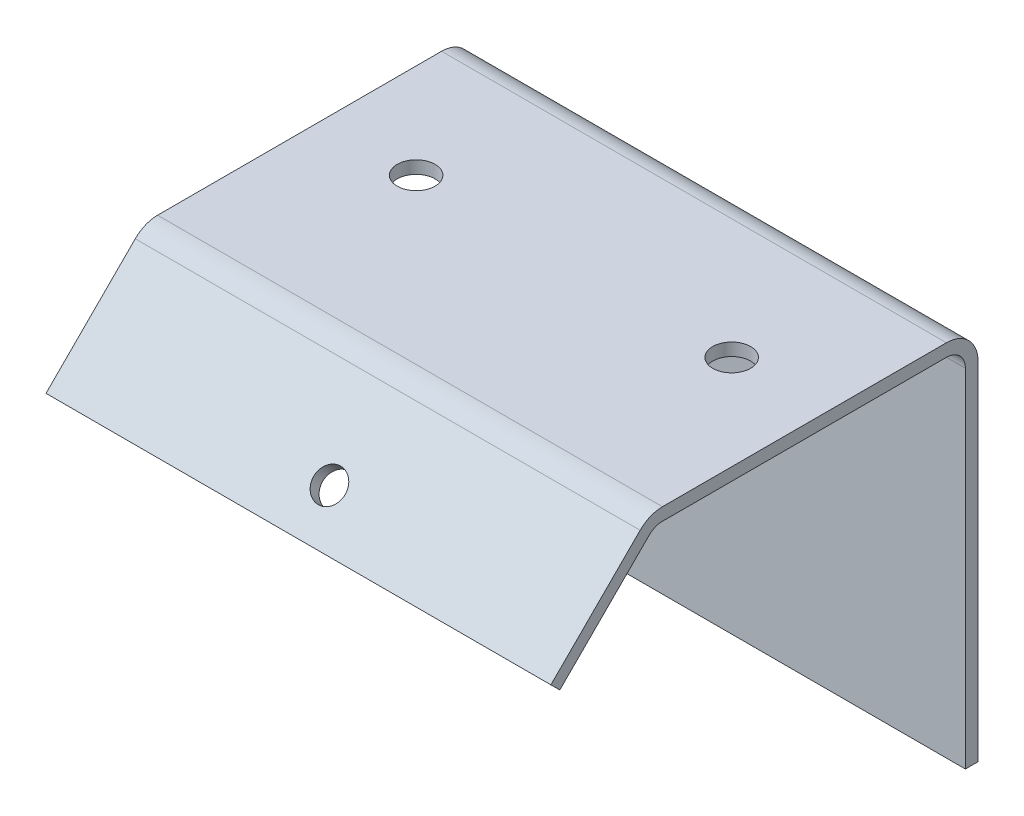
ISO-10303-21;
HEADER;
FILE_DESCRIPTION(('STEP AP214'),'2;1');
FILE_NAME('part.step','',(''),(''),'','','');
FILE_SCHEMA(('AUTOMOTIVE_DESIGN { 1 0 10303 214 1 1 1 1 }'));
ENDSEC;
DATA;
#1=APPLICATION_CONTEXT('core data for automotive mechanical design processes');
#2=APPLICATION_PROTOCOL_DEFINITION('international standard','automotive_design',2000,#1);
#3=PRODUCT_CONTEXT('',#1,'mechanical');
#4=PRODUCT('Part','Part','',(#3));
#5=PRODUCT_RELATED_PRODUCT_CATEGORY('part','',(#4));
#6=PRODUCT_DEFINITION_FORMATION('','',#4);
#7=PRODUCT_DEFINITION_CONTEXT('part definition',#1,'design');
#8=PRODUCT_DEFINITION('design','',#6,#7);
#9=PRODUCT_DEFINITION_SHAPE('','',#8);
#10=(LENGTH_UNIT() NAMED_UNIT(*) SI_UNIT(.MILLI.,.METRE.));
#11=(NAMED_UNIT(*) PLANE_ANGLE_UNIT() SI_UNIT($,.RADIAN.));
#12=(NAMED_UNIT(*) SI_UNIT($,.STERADIAN.) SOLID_ANGLE_UNIT());
#13=UNCERTAINTY_MEASURE_WITH_UNIT(LENGTH_MEASURE(1.E-05),#10,'distance_accuracy_value','');
#14=(GEOMETRIC_REPRESENTATION_CONTEXT(3) GLOBAL_UNCERTAINTY_ASSIGNED_CONTEXT((#13)) GLOBAL_UNIT_ASSIGNED_CONTEXT((#10,
#11,#12)) REPRESENTATION_CONTEXT('',''));
#15=CARTESIAN_POINT('',(0.,0.,0.));
#16=DIRECTION('',(0.,0.,1.));
#17=DIRECTION('',(1.,0.,0.));
#18=AXIS2_PLACEMENT_3D('',#15,#16,#17);
#19=CARTESIAN_POINT('',(40.,0.,2.));
#20=DIRECTION('',(0.,1.,0.));
#21=DIRECTION('',(0.,0.,1.));
#22=AXIS2_PLACEMENT_3D('',#19,#20,#21);
#23=PLANE('',#22);
#24=DIRECTION('',(0.,0.,-1.));
#25=VECTOR('',#24,1.);
#26=CARTESIAN_POINT('',(-40.,0.,2.));
#27=LINE('',#26,#25);
#28=CARTESIAN_POINT('',(-40.,0.,2.));
#29=VERTEX_POINT('',#28);
#30=CARTESIAN_POINT('',(-40.,0.,0.));
#31=VERTEX_POINT('',#30);
#32=EDGE_CURVE('E187',#29,#31,#27,.T.);
#33=ORIENTED_EDGE('',*,*,#32,.T.);
#34=DIRECTION('',(-1.,0.,0.));
#35=VECTOR('',#34,1.);
#36=CARTESIAN_POINT('',(40.,0.,0.));
#37=LINE('',#36,#35);
#38=CARTESIAN_POINT('',(40.,0.,0.));
#39=VERTEX_POINT('',#38);
#40=EDGE_CURVE('E12',#39,#31,#37,.T.);
#41=ORIENTED_EDGE('',*,*,#40,.F.);
#42=DIRECTION('',(0.,0.,-1.));
#43=VECTOR('',#42,1.);
#44=CARTESIAN_POINT('',(40.,0.,2.));
#45=LINE('',#44,#43);
#46=CARTESIAN_POINT('',(40.,0.,2.));
#47=VERTEX_POINT('',#46);
#48=EDGE_CURVE('E222',#47,#39,#45,.T.);
#49=ORIENTED_EDGE('',*,*,#48,.F.);
#50=DIRECTION('',(-1.,0.,0.));
#51=VECTOR('',#50,1.);
#52=CARTESIAN_POINT('',(40.,0.,2.));
#53=LINE('',#52,#51);
#54=EDGE_CURVE('E183',#47,#29,#53,.T.);
#55=ORIENTED_EDGE('',*,*,#54,.T.);
#56=EDGE_LOOP('',(#33,#41,#49,#55));
#57=FACE_BOUND('',#56,.T.);
#58=ADVANCED_FACE('F57',(#57),#23,.F.);
#59=CARTESIAN_POINT('',(40.,0.,0.));
#60=DIRECTION('',(0.,0.,1.));
#61=DIRECTION('',(1.,0.,0.));
#62=AXIS2_PLACEMENT_3D('',#59,#60,#61);
#63=PLANE('',#62);
#64=CARTESIAN_POINT('',(0.,25.,0.));
#65=DIRECTION('',(0.,0.,1.));
#66=DIRECTION('',(1.,0.,0.));
#67=AXIS2_PLACEMENT_3D('',#64,#65,#66);
#68=CIRCLE('',#67,4.);
#69=CARTESIAN_POINT('',(4.,25.,0.));
#70=VERTEX_POINT('',#69);
#71=EDGE_CURVE('E258',#70,#70,#68,.T.);
#72=ORIENTED_EDGE('',*,*,#71,.T.);
#73=EDGE_LOOP('',(#72));
#74=FACE_BOUND('',#73,.T.);
#75=DIRECTION('',(0.,1.,0.));
#76=VECTOR('',#75,1.);
#77=CARTESIAN_POINT('',(-40.,0.,0.));
#78=LINE('',#77,#76);
#79=CARTESIAN_POINT('',(-40.,55.,0.));
#80=VERTEX_POINT('',#79);
#81=EDGE_CURVE('E191',#31,#80,#78,.T.);
#82=ORIENTED_EDGE('',*,*,#81,.T.);
#83=DIRECTION('',(-1.,0.,0.));
#84=VECTOR('',#83,1.);
#85=CARTESIAN_POINT('',(40.,55.,0.));
#86=LINE('',#85,#84);
#87=CARTESIAN_POINT('',(40.,55.,0.));
#88=VERTEX_POINT('',#87);
#89=EDGE_CURVE('E68',#88,#80,#86,.T.);
#90=ORIENTED_EDGE('',*,*,#89,.F.);
#91=DIRECTION('',(0.,1.,0.));
#92=VECTOR('',#91,1.);
#93=CARTESIAN_POINT('',(40.,0.,0.));
#94=LINE('',#93,#92);
#95=EDGE_CURVE('E132',#39,#88,#94,.T.);
#96=ORIENTED_EDGE('',*,*,#95,.F.);
#97=ORIENTED_EDGE('',*,*,#40,.T.);
#98=EDGE_LOOP('',(#82,#90,#96,#97));
#99=FACE_BOUND('',#98,.T.);
#100=ADVANCED_FACE('F353',(#74,#99),#63,.F.);
#101=CARTESIAN_POINT('',(40.,54.9999866642685,5.00001333573149));
#102=DIRECTION('',(-1.,0.,0.));
#103=DIRECTION('',(0.,0.,1.));
#104=AXIS2_PLACEMENT_3D('',#101,#102,#103);
#105=CYLINDRICAL_SURFACE('',#104,5.00001333574928);
#106=CARTESIAN_POINT('',(-40.,54.9999866642685,5.00001333573149));
#107=DIRECTION('',(1.,0.,0.));
#108=DIRECTION('',(0.,0.,-1.));
#109=AXIS2_PLACEMENT_3D('',#106,#107,#108);
#110=CIRCLE('',#109,5.00001333574928);
#111=CARTESIAN_POINT('',(-40.,60.,5.));
#112=VERTEX_POINT('',#111);
#113=EDGE_CURVE('E195',#80,#112,#110,.T.);
#114=ORIENTED_EDGE('',*,*,#113,.T.);
#115=DIRECTION('',(-1.,0.,0.));
#116=VECTOR('',#115,1.);
#117=CARTESIAN_POINT('',(40.,60.,5.));
#118=LINE('',#117,#116);
#119=CARTESIAN_POINT('',(40.,60.,5.));
#120=VERTEX_POINT('',#119);
#121=EDGE_CURVE('E248',#120,#112,#118,.T.);
#122=ORIENTED_EDGE('',*,*,#121,.F.);
#123=CARTESIAN_POINT('',(40.,54.9999866642685,5.00001333573149));
#124=DIRECTION('',(1.,0.,0.));
#125=DIRECTION('',(0.,0.,-1.));
#126=AXIS2_PLACEMENT_3D('',#123,#124,#125);
#127=CIRCLE('',#126,5.00001333574928);
#128=EDGE_CURVE('E282',#88,#120,#127,.T.);
#129=ORIENTED_EDGE('',*,*,#128,.F.);
#130=ORIENTED_EDGE('',*,*,#89,.T.);
#131=EDGE_LOOP('',(#114,#122,#129,#130));
#132=FACE_BOUND('',#131,.T.);
#133=ADVANCED_FACE('F321',(#132),#105,.T.);
#134=CARTESIAN_POINT('',(40.,60.,5.));
#135=DIRECTION('',(0.,-1.,0.));
#136=DIRECTION('',(0.,0.,-1.));
#137=AXIS2_PLACEMENT_3D('',#134,#135,#136);
#138=PLANE('',#137);
#139=CARTESIAN_POINT('',(25.,60.,24.031));
#140=DIRECTION('',(0.,1.,0.));
#141=DIRECTION('',(0.,0.,1.));
#142=AXIS2_PLACEMENT_3D('',#139,#140,#141);
#143=CIRCLE('',#142,3.);
#144=CARTESIAN_POINT('',(25.,60.,27.031));
#145=VERTEX_POINT('',#144);
#146=EDGE_CURVE('E263',#145,#145,#143,.T.);
#147=ORIENTED_EDGE('',*,*,#146,.F.);
#148=EDGE_LOOP('',(#147));
#149=FACE_BOUND('',#148,.T.);
#150=CARTESIAN_POINT('',(-25.,60.,24.031));
#151=DIRECTION('',(0.,1.,0.));
#152=DIRECTION('',(0.,0.,1.));
#153=AXIS2_PLACEMENT_3D('',#150,#151,#152);
#154=CIRCLE('',#153,3.);
#155=CARTESIAN_POINT('',(-25.,60.,27.031));
#156=VERTEX_POINT('',#155);
#157=EDGE_CURVE('E276',#156,#156,#154,.T.);
#158=ORIENTED_EDGE('',*,*,#157,.F.);
#159=EDGE_LOOP('',(#158));
#160=FACE_BOUND('',#159,.T.);
#161=DIRECTION('',(0.,0.,1.));
#162=VECTOR('',#161,1.);
#163=CARTESIAN_POINT('',(-40.,60.,5.));
#164=LINE('',#163,#162);
#165=CARTESIAN_POINT('',(-40.,60.,50.));
#166=VERTEX_POINT('',#165);
#167=EDGE_CURVE('E198',#112,#166,#164,.T.);
#168=ORIENTED_EDGE('',*,*,#167,.T.);
#169=DIRECTION('',(-1.,0.,0.));
#170=VECTOR('',#169,1.);
#171=CARTESIAN_POINT('',(40.,60.,50.));
#172=LINE('',#171,#170);
#173=CARTESIAN_POINT('',(40.,60.,50.));
#174=VERTEX_POINT('',#173);
#175=EDGE_CURVE('E244',#174,#166,#172,.T.);
#176=ORIENTED_EDGE('',*,*,#175,.F.);
#177=DIRECTION('',(0.,0.,1.));
#178=VECTOR('',#177,1.);
#179=CARTESIAN_POINT('',(40.,60.,5.));
#180=LINE('',#179,#178);
#181=EDGE_CURVE('E285',#120,#174,#180,.T.);
#182=ORIENTED_EDGE('',*,*,#181,.F.);
#183=ORIENTED_EDGE('',*,*,#121,.T.);
#184=EDGE_LOOP('',(#168,#176,#182,#183));
#185=FACE_BOUND('',#184,.T.);
#186=ADVANCED_FACE('F317',(#149,#160,#185),#138,.F.);
#187=CARTESIAN_POINT('',(40.,55.0000756748714,50.0000235338065));
#188=DIRECTION('',(-1.,0.,0.));
#189=DIRECTION('',(0.,0.,1.));
#190=AXIS2_PLACEMENT_3D('',#187,#188,#189);
#191=CYLINDRICAL_SURFACE('',#190,4.99992432518401);
#192=CARTESIAN_POINT('',(-40.,55.0000756748714,50.0000235338065));
#193=DIRECTION('',(1.,0.,0.));
#194=DIRECTION('',(0.,0.,-1.));
#195=AXIS2_PLACEMENT_3D('',#192,#193,#194);
#196=CIRCLE('',#195,4.99992432518401);
#197=CARTESIAN_POINT('',(-40.,58.53553,53.53553));
#198=VERTEX_POINT('',#197);
#199=EDGE_CURVE('E201',#166,#198,#196,.T.);
#200=ORIENTED_EDGE('',*,*,#199,.T.);
#201=DIRECTION('',(-1.,0.,0.));
#202=VECTOR('',#201,1.);
#203=CARTESIAN_POINT('',(40.,58.53553,53.53553));
#204=LINE('',#203,#202);
#205=CARTESIAN_POINT('',(40.,58.53553,53.53553));
#206=VERTEX_POINT('',#205);
#207=EDGE_CURVE('E240',#206,#198,#204,.T.);
#208=ORIENTED_EDGE('',*,*,#207,.F.);
#209=CARTESIAN_POINT('',(40.,55.0000756748714,50.0000235338065));
#210=DIRECTION('',(1.,0.,0.));
#211=DIRECTION('',(0.,0.,-1.));
#212=AXIS2_PLACEMENT_3D('',#209,#210,#211);
#213=CIRCLE('',#212,4.99992432518401);
#214=EDGE_CURVE('E288',#174,#206,#213,.T.);
#215=ORIENTED_EDGE('',*,*,#214,.F.);
#216=ORIENTED_EDGE('',*,*,#175,.T.);
#217=EDGE_LOOP('',(#200,#208,#215,#216));
#218=FACE_BOUND('',#217,.T.);
#219=ADVANCED_FACE('F320',(#218),#191,.T.);
#220=CARTESIAN_POINT('',(40.,58.53553,53.53553));
#221=DIRECTION('',(0.,-0.707107031186514,-0.707106531186492));
#222=DIRECTION('',(0.,0.707106531186492,-0.707107031186514));
#223=AXIS2_PLACEMENT_3D('',#220,#221,#222);
#224=PLANE('',#223);
#225=CARTESIAN_POINT('',(0.,49.3095332618837,62.7615332618837));
#226=DIRECTION('',(0.,-0.707107031186514,-0.707106531186492));
#227=DIRECTION('',(0.,0.707106531186492,-0.707107031186514));
#228=AXIS2_PLACEMENT_3D('',#225,#226,#227);
#229=CIRCLE('',#228,2.5);
#230=CARTESIAN_POINT('',(0.,51.07729958985,60.9937656839174));
#231=VERTEX_POINT('',#230);
#232=EDGE_CURVE('E301',#231,#231,#229,.T.);
#233=ORIENTED_EDGE('',*,*,#232,.T.);
#234=EDGE_LOOP('',(#233));
#235=FACE_BOUND('',#234,.T.);
#236=DIRECTION('',(0.,-0.707106531186492,0.707107031186514));
#237=VECTOR('',#236,1.);
#238=CARTESIAN_POINT('',(-40.,58.53553,53.53553));
#239=LINE('',#238,#237);
#240=CARTESIAN_POINT('',(-40.,44.3934,67.67767));
#241=VERTEX_POINT('',#240);
#242=EDGE_CURVE('E204',#198,#241,#239,.T.);
#243=ORIENTED_EDGE('',*,*,#242,.T.);
#244=DIRECTION('',(-1.,0.,0.));
#245=VECTOR('',#244,1.);
#246=CARTESIAN_POINT('',(40.,44.3934,67.67767));
#247=LINE('',#246,#245);
#248=CARTESIAN_POINT('',(40.,44.3934,67.67767));
#249=VERTEX_POINT('',#248);
#250=EDGE_CURVE('E236',#249,#241,#247,.T.);
#251=ORIENTED_EDGE('',*,*,#250,.F.);
#252=DIRECTION('',(0.,-0.707106531186492,0.707107031186514));
#253=VECTOR('',#252,1.);
#254=CARTESIAN_POINT('',(40.,58.53553,53.53553));
#255=LINE('',#254,#253);
#256=EDGE_CURVE('E291',#206,#249,#255,.T.);
#257=ORIENTED_EDGE('',*,*,#256,.F.);
#258=ORIENTED_EDGE('',*,*,#207,.T.);
#259=EDGE_LOOP('',(#243,#251,#257,#258));
#260=FACE_BOUND('',#259,.T.);
#261=ADVANCED_FACE('F342',(#235,#260),#224,.F.);
#262=CARTESIAN_POINT('',(40.,44.3934,67.67767));
#263=DIRECTION('',(0.,0.707104281184673,-0.707109281179584));
#264=DIRECTION('',(0.,0.707109281179584,0.707104281184673));
#265=AXIS2_PLACEMENT_3D('',#262,#263,#264);
#266=PLANE('',#265);
#267=DIRECTION('',(0.,-0.707109281179584,-0.707104281184673));
#268=VECTOR('',#267,1.);
#269=CARTESIAN_POINT('',(-40.,44.3934,67.67767));
#270=LINE('',#269,#268);
#271=CARTESIAN_POINT('',(-40.,42.97918,66.26346));
#272=VERTEX_POINT('',#271);
#273=EDGE_CURVE('E207',#241,#272,#270,.T.);
#274=ORIENTED_EDGE('',*,*,#273,.T.);
#275=DIRECTION('',(-1.,0.,0.));
#276=VECTOR('',#275,1.);
#277=CARTESIAN_POINT('',(40.,42.97918,66.26346));
#278=LINE('',#277,#276);
#279=CARTESIAN_POINT('',(40.,42.97918,66.26346));
#280=VERTEX_POINT('',#279);
#281=EDGE_CURVE('E232',#280,#272,#278,.T.);
#282=ORIENTED_EDGE('',*,*,#281,.F.);
#283=DIRECTION('',(0.,-0.707109281179584,-0.707104281184673));
#284=VECTOR('',#283,1.);
#285=CARTESIAN_POINT('',(40.,44.3934,67.67767));
#286=LINE('',#285,#284);
#287=EDGE_CURVE('E293',#249,#280,#286,.T.);
#288=ORIENTED_EDGE('',*,*,#287,.F.);
#289=ORIENTED_EDGE('',*,*,#250,.T.);
#290=EDGE_LOOP('',(#274,#282,#288,#289));
#291=FACE_BOUND('',#290,.T.);
#292=ADVANCED_FACE('F346',(#291),#266,.F.);
#293=CARTESIAN_POINT('',(40.,42.97918,66.26346));
#294=DIRECTION('',(0.,0.707106781186547,0.707106781186548));
#295=DIRECTION('',(0.,-0.707106781186548,0.707106781186547));
#296=AXIS2_PLACEMENT_3D('',#293,#294,#295);
#297=PLANE('',#296);
#298=CARTESIAN_POINT('',(0.,47.89532,61.34732));
#299=DIRECTION('',(0.,0.707106781186547,0.707106781186548));
#300=DIRECTION('',(0.,-0.707106781186548,0.707106781186547));
#301=AXIS2_PLACEMENT_3D('',#298,#299,#300);
#302=CIRCLE('',#301,2.5);
#303=CARTESIAN_POINT('',(0.,46.1275530470336,63.1150869529664));
#304=VERTEX_POINT('',#303);
#305=EDGE_CURVE('E61',#304,#304,#302,.T.);
#306=ORIENTED_EDGE('',*,*,#305,.T.);
#307=EDGE_LOOP('',(#306));
#308=FACE_BOUND('',#307,.T.);
#309=DIRECTION('',(0.,0.707106781186548,-0.707106781186547));
#310=VECTOR('',#309,1.);
#311=CARTESIAN_POINT('',(-40.,42.97918,66.26346));
#312=LINE('',#311,#310);
#313=CARTESIAN_POINT('',(-40.,57.12132,52.12132));
#314=VERTEX_POINT('',#313);
#315=EDGE_CURVE('E210',#272,#314,#312,.T.);
#316=ORIENTED_EDGE('',*,*,#315,.T.);
#317=DIRECTION('',(-1.,0.,0.));
#318=VECTOR('',#317,1.);
#319=CARTESIAN_POINT('',(40.,57.12132,52.12132));
#320=LINE('',#319,#318);
#321=CARTESIAN_POINT('',(40.,57.12132,52.12132));
#322=VERTEX_POINT('',#321);
#323=EDGE_CURVE('E228',#322,#314,#320,.T.);
#324=ORIENTED_EDGE('',*,*,#323,.F.);
#325=DIRECTION('',(0.,0.707106781186548,-0.707106781186547));
#326=VECTOR('',#325,1.);
#327=CARTESIAN_POINT('',(40.,42.97918,66.26346));
#328=LINE('',#327,#326);
#329=EDGE_CURVE('E296',#280,#322,#328,.T.);
#330=ORIENTED_EDGE('',*,*,#329,.F.);
#331=ORIENTED_EDGE('',*,*,#281,.T.);
#332=EDGE_LOOP('',(#316,#324,#330,#331));
#333=FACE_BOUND('',#332,.T.);
#334=ADVANCED_FACE('F361',(#308,#333),#297,.F.);
#335=CARTESIAN_POINT('',(40.,55.0000175375442,50.0000065771733));
#336=DIRECTION('',(-1.,0.,0.));
#337=DIRECTION('',(0.,0.,1.));
#338=AXIS2_PLACEMENT_3D('',#335,#336,#337);
#339=CYLINDRICAL_SURFACE('',#338,2.99998246246303);
#340=CARTESIAN_POINT('',(-40.,55.0000175375442,50.0000065771733));
#341=DIRECTION('',(-1.,0.,0.));
#342=DIRECTION('',(0.,0.,1.));
#343=AXIS2_PLACEMENT_3D('',#340,#341,#342);
#344=CIRCLE('',#343,2.99998246246303);
#345=CARTESIAN_POINT('',(-40.,58.,50.));
#346=VERTEX_POINT('',#345);
#347=EDGE_CURVE('E213',#314,#346,#344,.T.);
#348=ORIENTED_EDGE('',*,*,#347,.T.);
#349=DIRECTION('',(-1.,0.,0.));
#350=VECTOR('',#349,1.);
#351=CARTESIAN_POINT('',(40.,58.,50.));
#352=LINE('',#351,#350);
#353=CARTESIAN_POINT('',(40.,58.,50.));
#354=VERTEX_POINT('',#353);
#355=EDGE_CURVE('E174',#354,#346,#352,.T.);
#356=ORIENTED_EDGE('',*,*,#355,.F.);
#357=CARTESIAN_POINT('',(40.,55.0000175375442,50.0000065771733));
#358=DIRECTION('',(-1.,0.,0.));
#359=DIRECTION('',(0.,0.,1.));
#360=AXIS2_PLACEMENT_3D('',#357,#358,#359);
#361=CIRCLE('',#360,2.99998246246303);
#362=EDGE_CURVE('E163',#322,#354,#361,.T.);
#363=ORIENTED_EDGE('',*,*,#362,.F.);
#364=ORIENTED_EDGE('',*,*,#323,.T.);
#365=EDGE_LOOP('',(#348,#356,#363,#364));
#366=FACE_BOUND('',#365,.T.);
#367=ADVANCED_FACE('F359',(#366),#339,.F.);
#368=CARTESIAN_POINT('',(40.,58.,50.));
#369=DIRECTION('',(0.,1.,0.));
#370=DIRECTION('',(0.,0.,1.));
#371=AXIS2_PLACEMENT_3D('',#368,#369,#370);
#372=PLANE('',#371);
#373=CARTESIAN_POINT('',(25.,58.,24.031));
#374=DIRECTION('',(0.,1.,0.));
#375=DIRECTION('',(0.,0.,1.));
#376=AXIS2_PLACEMENT_3D('',#373,#374,#375);
#377=CIRCLE('',#376,3.);
#378=CARTESIAN_POINT('',(25.,58.,27.031));
#379=VERTEX_POINT('',#378);
#380=EDGE_CURVE('E262',#379,#379,#377,.T.);
#381=ORIENTED_EDGE('',*,*,#380,.T.);
#382=EDGE_LOOP('',(#381));
#383=FACE_BOUND('',#382,.T.);
#384=CARTESIAN_POINT('',(-25.,58.,24.031));
#385=DIRECTION('',(0.,1.,0.));
#386=DIRECTION('',(0.,0.,1.));
#387=AXIS2_PLACEMENT_3D('',#384,#385,#386);
#388=CIRCLE('',#387,3.);
#389=CARTESIAN_POINT('',(-25.,58.,27.031));
#390=VERTEX_POINT('',#389);
#391=EDGE_CURVE('E259',#390,#390,#388,.T.);
#392=ORIENTED_EDGE('',*,*,#391,.T.);
#393=EDGE_LOOP('',(#392));
#394=FACE_BOUND('',#393,.T.);
#395=DIRECTION('',(0.,0.,-1.));
#396=VECTOR('',#395,1.);
#397=CARTESIAN_POINT('',(-40.,58.,50.));
#398=LINE('',#397,#396);
#399=CARTESIAN_POINT('',(-40.,58.,5.));
#400=VERTEX_POINT('',#399);
#401=EDGE_CURVE('E172',#346,#400,#398,.T.);
#402=ORIENTED_EDGE('',*,*,#401,.T.);
#403=DIRECTION('',(-1.,0.,0.));
#404=VECTOR('',#403,1.);
#405=CARTESIAN_POINT('',(40.,58.,5.));
#406=LINE('',#405,#404);
#407=CARTESIAN_POINT('',(40.,58.,5.));
#408=VERTEX_POINT('',#407);
#409=EDGE_CURVE('E169',#408,#400,#406,.T.);
#410=ORIENTED_EDGE('',*,*,#409,.F.);
#411=DIRECTION('',(0.,0.,-1.));
#412=VECTOR('',#411,1.);
#413=CARTESIAN_POINT('',(40.,58.,50.));
#414=LINE('',#413,#412);
#415=EDGE_CURVE('E157',#354,#408,#414,.T.);
#416=ORIENTED_EDGE('',*,*,#415,.F.);
#417=ORIENTED_EDGE('',*,*,#355,.T.);
#418=EDGE_LOOP('',(#402,#410,#416,#417));
#419=FACE_BOUND('',#418,.T.);
#420=ADVANCED_FACE('F170',(#383,#394,#419),#372,.F.);
#421=CARTESIAN_POINT('',(40.,54.9999988270135,5.00000117298652));
#422=DIRECTION('',(-1.,0.,0.));
#423=DIRECTION('',(0.,0.,1.));
#424=AXIS2_PLACEMENT_3D('',#421,#422,#423);
#425=CYLINDRICAL_SURFACE('',#424,3.00000117298675);
#426=CARTESIAN_POINT('',(-40.,54.9999988270135,5.00000117298652));
#427=DIRECTION('',(-1.,0.,0.));
#428=DIRECTION('',(0.,0.,1.));
#429=AXIS2_PLACEMENT_3D('',#426,#427,#428);
#430=CIRCLE('',#429,3.00000117298675);
#431=CARTESIAN_POINT('',(-40.,55.,2.));
#432=VERTEX_POINT('',#431);
#433=EDGE_CURVE('E118',#400,#432,#430,.T.);
#434=ORIENTED_EDGE('',*,*,#433,.T.);
#435=DIRECTION('',(-1.,0.,0.));
#436=VECTOR('',#435,1.);
#437=CARTESIAN_POINT('',(40.,55.,2.));
#438=LINE('',#437,#436);
#439=CARTESIAN_POINT('',(40.,55.,2.));
#440=VERTEX_POINT('',#439);
#441=EDGE_CURVE('E175',#440,#432,#438,.T.);
#442=ORIENTED_EDGE('',*,*,#441,.F.);
#443=CARTESIAN_POINT('',(40.,54.9999988270135,5.00000117298652));
#444=DIRECTION('',(-1.,0.,0.));
#445=DIRECTION('',(0.,0.,1.));
#446=AXIS2_PLACEMENT_3D('',#443,#444,#445);
#447=CIRCLE('',#446,3.00000117298675);
#448=EDGE_CURVE('E161',#408,#440,#447,.T.);
#449=ORIENTED_EDGE('',*,*,#448,.F.);
#450=ORIENTED_EDGE('',*,*,#409,.T.);
#451=EDGE_LOOP('',(#434,#442,#449,#450));
#452=FACE_BOUND('',#451,.T.);
#453=ADVANCED_FACE('F177',(#452),#425,.F.);
#454=CARTESIAN_POINT('',(40.,55.,2.));
#455=DIRECTION('',(0.,0.,-1.));
#456=DIRECTION('',(-1.,0.,0.));
#457=AXIS2_PLACEMENT_3D('',#454,#455,#456);
#458=PLANE('',#457);
#459=CARTESIAN_POINT('',(0.,25.,2.));
#460=DIRECTION('',(0.,0.,-1.));
#461=DIRECTION('',(-1.,0.,0.));
#462=AXIS2_PLACEMENT_3D('',#459,#460,#461);
#463=CIRCLE('',#462,4.);
#464=CARTESIAN_POINT('',(-4.,25.,2.));
#465=VERTEX_POINT('',#464);
#466=EDGE_CURVE('E192',#465,#465,#463,.F.);
#467=ORIENTED_EDGE('',*,*,#466,.F.);
#468=EDGE_LOOP('',(#467));
#469=FACE_BOUND('',#468,.T.);
#470=DIRECTION('',(0.,-1.,0.));
#471=VECTOR('',#470,1.);
#472=CARTESIAN_POINT('',(-40.,55.,2.));
#473=LINE('',#472,#471);
#474=EDGE_CURVE('E124',#432,#29,#473,.T.);
#475=ORIENTED_EDGE('',*,*,#474,.T.);
#476=ORIENTED_EDGE('',*,*,#54,.F.);
#477=DIRECTION('',(0.,-1.,0.));
#478=VECTOR('',#477,1.);
#479=CARTESIAN_POINT('',(40.,55.,2.));
#480=LINE('',#479,#478);
#481=EDGE_CURVE('E77',#440,#47,#480,.T.);
#482=ORIENTED_EDGE('',*,*,#481,.F.);
#483=ORIENTED_EDGE('',*,*,#441,.T.);
#484=EDGE_LOOP('',(#475,#476,#482,#483));
#485=FACE_BOUND('',#484,.T.);
#486=ADVANCED_FACE('F356',(#469,#485),#458,.F.);
#487=CARTESIAN_POINT('',(40.,54.9999866642685,5.00001333573149));
#488=DIRECTION('',(1.,0.,0.));
#489=DIRECTION('',(0.,0.,-1.));
#490=AXIS2_PLACEMENT_3D('',#487,#488,#489);
#491=PLANE('',#490);
#492=ORIENTED_EDGE('',*,*,#48,.T.);
#493=ORIENTED_EDGE('',*,*,#95,.T.);
#494=ORIENTED_EDGE('',*,*,#128,.T.);
#495=ORIENTED_EDGE('',*,*,#181,.T.);
#496=ORIENTED_EDGE('',*,*,#214,.T.);
#497=ORIENTED_EDGE('',*,*,#256,.T.);
#498=ORIENTED_EDGE('',*,*,#287,.T.);
#499=ORIENTED_EDGE('',*,*,#329,.T.);
#500=ORIENTED_EDGE('',*,*,#362,.T.);
#501=ORIENTED_EDGE('',*,*,#415,.T.);
#502=ORIENTED_EDGE('',*,*,#448,.T.);
#503=ORIENTED_EDGE('',*,*,#481,.T.);
#504=EDGE_LOOP('',(#492,#493,#494,#495,#496,#497,#498,#499,#500,#501,#502,#503));
#505=FACE_BOUND('',#504,.T.);
#506=ADVANCED_FACE('F159',(#505),#491,.T.);
#507=CARTESIAN_POINT('',(-40.,54.9999866642685,5.00001333573149));
#508=DIRECTION('',(1.,0.,0.));
#509=DIRECTION('',(0.,0.,-1.));
#510=AXIS2_PLACEMENT_3D('',#507,#508,#509);
#511=PLANE('',#510);
#512=ORIENTED_EDGE('',*,*,#32,.F.);
#513=ORIENTED_EDGE('',*,*,#474,.F.);
#514=ORIENTED_EDGE('',*,*,#433,.F.);
#515=ORIENTED_EDGE('',*,*,#401,.F.);
#516=ORIENTED_EDGE('',*,*,#347,.F.);
#517=ORIENTED_EDGE('',*,*,#315,.F.);
#518=ORIENTED_EDGE('',*,*,#273,.F.);
#519=ORIENTED_EDGE('',*,*,#242,.F.);
#520=ORIENTED_EDGE('',*,*,#199,.F.);
#521=ORIENTED_EDGE('',*,*,#167,.F.);
#522=ORIENTED_EDGE('',*,*,#113,.F.);
#523=ORIENTED_EDGE('',*,*,#81,.F.);
#524=EDGE_LOOP('',(#512,#513,#514,#515,#516,#517,#518,#519,#520,#521,#522,#523));
#525=FACE_BOUND('',#524,.T.);
#526=ADVANCED_FACE('F337',(#525),#511,.F.);
#527=CARTESIAN_POINT('',(0.,25.,67.67767));
#528=DIRECTION('',(0.,0.,-1.));
#529=DIRECTION('',(-1.,0.,0.));
#530=AXIS2_PLACEMENT_3D('',#527,#528,#529);
#531=CYLINDRICAL_SURFACE('',#530,4.);
#532=ORIENTED_EDGE('',*,*,#71,.F.);
#533=EDGE_LOOP('',(#532));
#534=FACE_BOUND('',#533,.T.);
#535=ORIENTED_EDGE('',*,*,#466,.T.);
#536=EDGE_LOOP('',(#535));
#537=FACE_BOUND('',#536,.T.);
#538=ADVANCED_FACE('F400',(#534,#537),#531,.F.);
#539=CARTESIAN_POINT('',(-25.,0.,24.031));
#540=DIRECTION('',(0.,1.,0.));
#541=DIRECTION('',(0.,0.,1.));
#542=AXIS2_PLACEMENT_3D('',#539,#540,#541);
#543=CYLINDRICAL_SURFACE('',#542,3.);
#544=ORIENTED_EDGE('',*,*,#157,.T.);
#545=EDGE_LOOP('',(#544));
#546=FACE_BOUND('',#545,.T.);
#547=ORIENTED_EDGE('',*,*,#391,.F.);
#548=EDGE_LOOP('',(#547));
#549=FACE_BOUND('',#548,.T.);
#550=ADVANCED_FACE('F403',(#546,#549),#543,.F.);
#551=CARTESIAN_POINT('',(25.,0.,24.031));
#552=DIRECTION('',(0.,1.,0.));
#553=DIRECTION('',(0.,0.,1.));
#554=AXIS2_PLACEMENT_3D('',#551,#552,#553);
#555=CYLINDRICAL_SURFACE('',#554,3.);
#556=ORIENTED_EDGE('',*,*,#146,.T.);
#557=EDGE_LOOP('',(#556));
#558=FACE_BOUND('',#557,.T.);
#559=ORIENTED_EDGE('',*,*,#380,.F.);
#560=EDGE_LOOP('',(#559));
#561=FACE_BOUND('',#560,.T.);
#562=ADVANCED_FACE('F314',(#558,#561),#555,.F.);
#563=CARTESIAN_POINT('',(0.,46.34,59.792));
#564=DIRECTION('',(0.,0.707106781186547,0.707106781186548));
#565=DIRECTION('',(0.,-0.707106781186548,0.707106781186547));
#566=AXIS2_PLACEMENT_3D('',#563,#564,#565);
#567=CYLINDRICAL_SURFACE('',#566,2.5);
#568=ORIENTED_EDGE('',*,*,#305,.F.);
#569=EDGE_LOOP('',(#568));
#570=FACE_BOUND('',#569,.T.);
#571=ORIENTED_EDGE('',*,*,#232,.F.);
#572=EDGE_LOOP('',(#571));
#573=FACE_BOUND('',#572,.T.);
#574=ADVANCED_FACE('F407',(#570,#573),#567,.F.);
#575=CLOSED_SHELL('',(#58,#100,#133,#186,#219,#261,#292,#334,#367,#420,#453,#486,#506,#526,#538,
#550,#562,#574));
#576=MANIFOLD_SOLID_BREP('B2',#575);
#577=ADVANCED_BREP_SHAPE_REPRESENTATION('',(#18,#576),#14);
#578=SHAPE_DEFINITION_REPRESENTATION(#9,#577);
ENDSEC;
END-ISO-10303-21;
